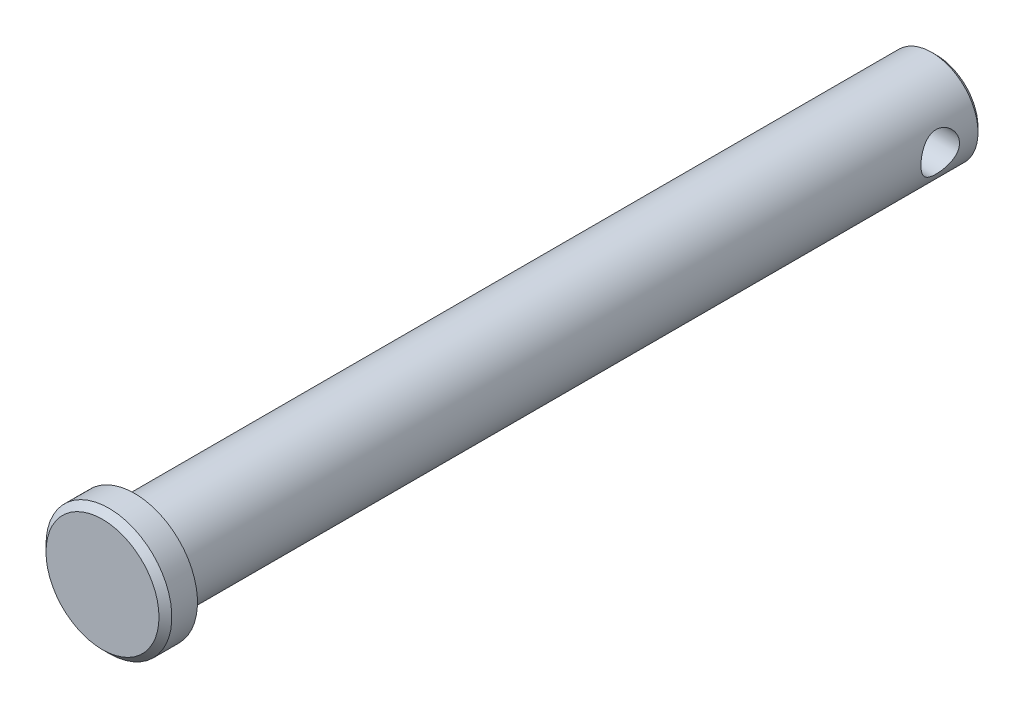
ISO-10303-21;
HEADER;
FILE_DESCRIPTION(('STEP AP214'),'2;1');
FILE_NAME('part.step','',(''),(''),'','','');
FILE_SCHEMA(('AUTOMOTIVE_DESIGN { 1 0 10303 214 1 1 1 1 }'));
ENDSEC;
DATA;
#1=APPLICATION_CONTEXT('core data for automotive mechanical design processes');
#2=APPLICATION_PROTOCOL_DEFINITION('international standard','automotive_design',2000,#1);
#3=PRODUCT_CONTEXT('',#1,'mechanical');
#4=PRODUCT('Part','Part','',(#3));
#5=PRODUCT_RELATED_PRODUCT_CATEGORY('part','',(#4));
#6=PRODUCT_DEFINITION_FORMATION('','',#4);
#7=PRODUCT_DEFINITION_CONTEXT('part definition',#1,'design');
#8=PRODUCT_DEFINITION('design','',#6,#7);
#9=PRODUCT_DEFINITION_SHAPE('','',#8);
#10=(LENGTH_UNIT() NAMED_UNIT(*) SI_UNIT(.MILLI.,.METRE.));
#11=(NAMED_UNIT(*) PLANE_ANGLE_UNIT() SI_UNIT($,.RADIAN.));
#12=(NAMED_UNIT(*) SI_UNIT($,.STERADIAN.) SOLID_ANGLE_UNIT());
#13=UNCERTAINTY_MEASURE_WITH_UNIT(LENGTH_MEASURE(1.E-05),#10,'distance_accuracy_value','');
#14=(GEOMETRIC_REPRESENTATION_CONTEXT(3) GLOBAL_UNCERTAINTY_ASSIGNED_CONTEXT((#13)) GLOBAL_UNIT_ASSIGNED_CONTEXT((#10,
#11,#12)) REPRESENTATION_CONTEXT('',''));
#15=CARTESIAN_POINT('',(0.,0.,0.));
#16=DIRECTION('',(0.,0.,1.));
#17=DIRECTION('',(1.,0.,0.));
#18=AXIS2_PLACEMENT_3D('',#15,#16,#17);
#19=CARTESIAN_POINT('',(0.,0.,41.275));
#20=DIRECTION('',(0.,0.,-1.));
#21=DIRECTION('',(-1.,0.,0.));
#22=AXIS2_PLACEMENT_3D('',#19,#20,#21);
#23=CYLINDRICAL_SURFACE('',#22,4.7625);
#24=CARTESIAN_POINT('',(0.,0.,-40.79875));
#25=DIRECTION('',(0.,0.,1.));
#26=DIRECTION('',(1.,0.,0.));
#27=AXIS2_PLACEMENT_3D('',#24,#25,#26);
#28=CIRCLE('',#27,4.7625);
#29=CARTESIAN_POINT('',(4.7625,0.,-40.79875));
#30=VERTEX_POINT('',#29);
#31=EDGE_CURVE('E40',#30,#30,#28,.T.);
#32=ORIENTED_EDGE('',*,*,#31,.T.);
#33=EDGE_LOOP('',(#32));
#34=FACE_BOUND('',#33,.T.);
#35=CARTESIAN_POINT('',(-4.7625,0.,-34.925));
#36=CARTESIAN_POINT('',(-4.76249140158045,-0.106295908560073,-34.9250114380824));
#37=CARTESIAN_POINT('',(-4.75890007347352,-0.212758967838845,-34.9335914841634));
#38=CARTESIAN_POINT('',(-4.74488118807538,-0.422667701710699,-34.9676070155608));
#39=CARTESIAN_POINT('',(-4.73443579242881,-0.526104765072408,-34.993086485087));
#40=CARTESIAN_POINT('',(-4.70783108848027,-0.726580864674278,-35.0597963582017));
#41=CARTESIAN_POINT('',(-4.69169114960318,-0.823640282526702,-35.1009734057807));
#42=CARTESIAN_POINT('',(-4.65526892272179,-1.00937973872919,-35.1976893568817));
#43=CARTESIAN_POINT('',(-4.63498788984898,-1.0980623041503,-35.2532239101163));
#44=CARTESIAN_POINT('',(-4.59117427508592,-1.26912434065072,-35.380023509863));
#45=CARTESIAN_POINT('',(-4.56753520905172,-1.35102801218446,-35.4518933277037));
#46=CARTESIAN_POINT('',(-4.52013183583765,-1.50202871598238,-35.6080446314673));
#47=CARTESIAN_POINT('',(-4.4963674694456,-1.57111900525552,-35.69233261077));
#48=CARTESIAN_POINT('',(-4.4500962212813,-1.69789058594091,-35.8759550093843));
#49=CARTESIAN_POINT('',(-4.42770874161498,-1.75484326694355,-35.9758256993771));
#50=CARTESIAN_POINT('',(-4.38841471116746,-1.85092880684824,-36.1847975469495));
#51=CARTESIAN_POINT('',(-4.37150533813807,-1.89007084577611,-36.2938939149316));
#52=CARTESIAN_POINT('',(-4.34623456677982,-1.94745924820552,-36.5127439856816));
#53=CARTESIAN_POINT('',(-4.33750065397212,-1.96662131880699,-36.6222128923851));
#54=CARTESIAN_POINT('',(-4.32849855373462,-1.98636270823876,-36.8431338521399));
#55=CARTESIAN_POINT('',(-4.328225697501,-1.98695227536355,-36.9545847775409));
#56=CARTESIAN_POINT('',(-4.33586127302854,-1.97022164952332,-37.1671850959405));
#57=CARTESIAN_POINT('',(-4.34314413823751,-1.95427093765777,-37.2684692407961));
#58=CARTESIAN_POINT('',(-4.36401341403402,-1.90720965737545,-37.4667654444631));
#59=CARTESIAN_POINT('',(-4.37760103179408,-1.87609618568393,-37.5637766812432));
#60=CARTESIAN_POINT('',(-4.40985568326751,-1.79898609480018,-37.7532228534989));
#61=CARTESIAN_POINT('',(-4.42862465094254,-1.75268686068537,-37.8455164807));
#62=CARTESIAN_POINT('',(-4.46910350686474,-1.64673347596642,-38.0213834025347));
#63=CARTESIAN_POINT('',(-4.49081455356025,-1.58707405869977,-38.104953239099));
#64=CARTESIAN_POINT('',(-4.53696350793792,-1.45017484530084,-38.2684336844884));
#65=CARTESIAN_POINT('',(-4.561476802296,-1.37187540459195,-38.3474381757244));
#66=CARTESIAN_POINT('',(-4.6089200606614,-1.20289572579428,-38.4914989359477));
#67=CARTESIAN_POINT('',(-4.63184965292253,-1.11221259562443,-38.5565519375613));
#68=CARTESIAN_POINT('',(-4.67420775145901,-0.918286118550733,-38.6721918699908));
#69=CARTESIAN_POINT('',(-4.69354323137542,-0.814801174635689,-38.7224102441767));
#70=CARTESIAN_POINT('',(-4.72582051746,-0.59984068901134,-38.8044073091202));
#71=CARTESIAN_POINT('',(-4.73876585655208,-0.488369601737113,-38.8361961907108));
#72=CARTESIAN_POINT('',(-4.75614430383386,-0.268173379937133,-38.878535387501));
#73=CARTESIAN_POINT('',(-4.76106396412311,-0.159720415379836,-38.890301723692));
#74=CARTESIAN_POINT('',(-4.76338979960382,0.0577130156000446,-38.8958871299874));
#75=CARTESIAN_POINT('',(-4.76079813192703,0.166693321604812,-38.8897113527751));
#76=CARTESIAN_POINT('',(-4.74870808030392,0.37639345971703,-38.8604584028704));
#77=CARTESIAN_POINT('',(-4.73955883563333,0.477254834540027,-38.8382351978707));
#78=CARTESIAN_POINT('',(-4.71564663251208,0.673707613991607,-38.7787067411665));
#79=CARTESIAN_POINT('',(-4.70088296486029,0.769298351097898,-38.7413995840539));
#80=CARTESIAN_POINT('',(-4.666587546492,0.955848037292255,-38.651543576057));
#81=CARTESIAN_POINT('',(-4.64692192707484,1.04657086350783,-38.5985572592557));
#82=CARTESIAN_POINT('',(-4.60492164769306,1.21816211826739,-38.4793277627557));
#83=CARTESIAN_POINT('',(-4.58258587495364,1.29902640975558,-38.4130790481973));
#84=CARTESIAN_POINT('',(-4.53567939534007,1.45467932056039,-38.2636661171801));
#85=CARTESIAN_POINT('',(-4.51106304400759,1.52862073304299,-38.1796313765093));
#86=CARTESIAN_POINT('',(-4.46380134619208,1.66158838069249,-37.9999537244526));
#87=CARTESIAN_POINT('',(-4.44115644808334,1.72061122865917,-37.9043081841649));
#88=CARTESIAN_POINT('',(-4.40025450662331,1.8227033683131,-37.7021499967072));
#89=CARTESIAN_POINT('',(-4.3820645555624,1.86553345201759,-37.5955019686202));
#90=CARTESIAN_POINT('',(-4.35305764608595,1.93226394648122,-37.3755116823265));
#91=CARTESIAN_POINT('',(-4.34223460919756,1.95617996596104,-37.2621750270577));
#92=CARTESIAN_POINT('',(-4.33011523702907,1.98285227553879,-37.0414253150213));
#93=CARTESIAN_POINT('',(-4.32814969660371,1.98709566405842,-36.9342278486105));
#94=CARTESIAN_POINT('',(-4.33218991655001,1.9782722614421,-36.7207119579385));
#95=CARTESIAN_POINT('',(-4.33819445320237,1.96520812768995,-36.614393401252));
#96=CARTESIAN_POINT('',(-4.3568866269235,1.92338967589029,-36.4107527633931));
#97=CARTESIAN_POINT('',(-4.36925013318788,1.89539409419702,-36.3132422808769));
#98=CARTESIAN_POINT('',(-4.39901300153713,1.82524921020888,-36.1242800160954));
#99=CARTESIAN_POINT('',(-4.41641377846563,1.78309593083637,-36.0328299449294));
#100=CARTESIAN_POINT('',(-4.45558790364021,1.68291328922589,-35.8525827651808));
#101=CARTESIAN_POINT('',(-4.47756125557966,1.62408172945392,-35.7642758008579));
#102=CARTESIAN_POINT('',(-4.5228460637297,1.49333596530074,-35.5983220287649));
#103=CARTESIAN_POINT('',(-4.54615798199076,1.42141722463767,-35.5206789337341));
#104=CARTESIAN_POINT('',(-4.59353273649544,1.26031949767388,-35.3724389678255));
#105=CARTESIAN_POINT('',(-4.61752660299969,1.17026489966908,-35.3027671628655));
#106=CARTESIAN_POINT('',(-4.66185477999957,0.978852625814453,-35.1794771174995));
#107=CARTESIAN_POINT('',(-4.68218742117825,0.877489827988869,-35.1258661926128));
#108=CARTESIAN_POINT('',(-4.71660828587906,0.667912140039742,-35.0373793703642));
#109=CARTESIAN_POINT('',(-4.73079417348867,0.559838210681756,-35.002208432995));
#110=CARTESIAN_POINT('',(-4.75172103007692,0.33878904468141,-34.9508662025889));
#111=CARTESIAN_POINT('',(-4.75848530476497,0.225830315707268,-34.9346354224838));
#112=CARTESIAN_POINT('',(-4.76206006515682,0.074987280046702,-34.9260586067753));
#113=CARTESIAN_POINT('',(-4.76250303375275,0.0375040440476048,-34.9249959643381));
#114=CARTESIAN_POINT('',(-4.7625,0.,-34.925));
#115=B_SPLINE_CURVE_WITH_KNOTS('',3,(#35,#36,#37,#38,#39,#40,#41,#42,#43,#44,#45,#46,#47,#48,
#49,#50,#51,#52,#53,#54,#55,#56,#57,#58,#59,#60,#61,#62,#63,#64,#65,#66,#67,#68,#69,#70,#71,#72,
#73,#74,#75,#76,#77,#78,#79,#80,#81,#82,#83,#84,#85,#86,#87,#88,#89,#90,#91,#92,#93,#94,#95,#96,
#97,#98,#99,#100,#101,#102,#103,#104,#105,#106,#107,#108,#109,#110,#111,#112,#113,#114),
.UNSPECIFIED.,.T.,.F.,(4,2,2,2,2,2,2,2,2,2,2,2,2,2,2,2,2,2,2,2,2,2,2,2,2,2,2,2,2,2,2,2,2,2,2,2,
2,2,2,4),(0.,0.318780983728251,0.638394933248055,0.956932064901255,1.2753727935041,
1.60842223858481,1.94164645533701,2.2912661270586,2.64070539184808,2.97331246105872,
3.30573599470361,3.61267624559059,3.9196752906695,4.23320706980709,4.54686266326065,
4.88702574040534,5.22726839536908,5.57536437409041,5.92326768446546,6.24916903886785,
6.57497680895409,6.88461586205457,7.19429404105333,7.51359202244555,7.83302353682824,
8.17528349746504,8.51762109719041,8.86483476520742,9.21176159730895,9.53198305625933,
9.85215535434837,10.1574226931906,10.462775857341,10.7864893076844,11.1103151781368,
11.4577262432026,11.8052953096787,12.1471190861327,12.4878663512005,12.6003408219232),.UNSPECIFIED.);
#116=CARTESIAN_POINT('',(-4.7625,0.,-34.925));
#117=VERTEX_POINT('',#116);
#118=EDGE_CURVE('E51',#117,#117,#115,.T.);
#119=ORIENTED_EDGE('',*,*,#118,.T.);
#120=EDGE_LOOP('',(#119));
#121=FACE_BOUND('',#120,.T.);
#122=CARTESIAN_POINT('',(4.7625,0.,-38.89375));
#123=CARTESIAN_POINT('',(4.76249140158045,-0.106295908560074,-38.8937385619176));
#124=CARTESIAN_POINT('',(4.75890007347352,-0.212758967838847,-38.8851585158366));
#125=CARTESIAN_POINT('',(4.74488118807538,-0.4226677017107,-38.8511429844392));
#126=CARTESIAN_POINT('',(4.73443579242881,-0.526104765072408,-38.825663514913));
#127=CARTESIAN_POINT('',(4.70783108848027,-0.726580864674276,-38.7589536417983));
#128=CARTESIAN_POINT('',(4.69169114960318,-0.8236402825267,-38.7177765942193));
#129=CARTESIAN_POINT('',(4.65526892272179,-1.00937973872918,-38.6210606431183));
#130=CARTESIAN_POINT('',(4.63498788984898,-1.0980623041503,-38.5655260898838));
#131=CARTESIAN_POINT('',(4.59117427508592,-1.26912434065072,-38.438726490137));
#132=CARTESIAN_POINT('',(4.56753520905172,-1.35102801218446,-38.3668566722963));
#133=CARTESIAN_POINT('',(4.52013183583765,-1.50202871598238,-38.2107053685327));
#134=CARTESIAN_POINT('',(4.4963674694456,-1.57111900525552,-38.12641738923));
#135=CARTESIAN_POINT('',(4.4500962212813,-1.69789058594091,-37.9427949906157));
#136=CARTESIAN_POINT('',(4.42770874161498,-1.75484326694355,-37.8429243006229));
#137=CARTESIAN_POINT('',(4.38841471116746,-1.85092880684824,-37.6339524530505));
#138=CARTESIAN_POINT('',(4.37150533813807,-1.89007084577611,-37.5248560850684));
#139=CARTESIAN_POINT('',(4.34623456677982,-1.94745924820552,-37.3060060143184));
#140=CARTESIAN_POINT('',(4.33750065397212,-1.96662131880698,-37.196537107615));
#141=CARTESIAN_POINT('',(4.32849855373462,-1.98636270823876,-36.9756161478601));
#142=CARTESIAN_POINT('',(4.328225697501,-1.98695227536355,-36.8641652224591));
#143=CARTESIAN_POINT('',(4.33586127302854,-1.97022164952332,-36.6515649040595));
#144=CARTESIAN_POINT('',(4.34314413823751,-1.95427093765777,-36.5502807592039));
#145=CARTESIAN_POINT('',(4.36401341403402,-1.90720965737545,-36.3519845555369));
#146=CARTESIAN_POINT('',(4.37760103179407,-1.87609618568393,-36.2549733187568));
#147=CARTESIAN_POINT('',(4.40985568326751,-1.79898609480018,-36.0655271465011));
#148=CARTESIAN_POINT('',(4.42862465094254,-1.75268686068537,-35.9732335193));
#149=CARTESIAN_POINT('',(4.46910350686474,-1.64673347596642,-35.7973665974653));
#150=CARTESIAN_POINT('',(4.49081455356025,-1.58707405869977,-35.713796760901));
#151=CARTESIAN_POINT('',(4.53696350793792,-1.45017484530084,-35.5503163155116));
#152=CARTESIAN_POINT('',(4.561476802296,-1.37187540459195,-35.4713118242756));
#153=CARTESIAN_POINT('',(4.6089200606614,-1.20289572579428,-35.3272510640523));
#154=CARTESIAN_POINT('',(4.63184965292253,-1.11221259562443,-35.2621980624387));
#155=CARTESIAN_POINT('',(4.67420775145901,-0.918286118550734,-35.1465581300092));
#156=CARTESIAN_POINT('',(4.69354323137542,-0.814801174635689,-35.0963397558233));
#157=CARTESIAN_POINT('',(4.72582051746,-0.599840689011341,-35.0143426908798));
#158=CARTESIAN_POINT('',(4.73876585655208,-0.488369601737113,-34.9825538092892));
#159=CARTESIAN_POINT('',(4.75614430383386,-0.268173379937133,-34.940214612499));
#160=CARTESIAN_POINT('',(4.76106396412311,-0.159720415379836,-34.9284482763081));
#161=CARTESIAN_POINT('',(4.76338979960382,0.0577130156000439,-34.9228628700126));
#162=CARTESIAN_POINT('',(4.76079813192703,0.166693321604811,-34.929038647225));
#163=CARTESIAN_POINT('',(4.74870808030392,0.376393459717029,-34.9582915971296));
#164=CARTESIAN_POINT('',(4.73955883563333,0.477254834540026,-34.9805148021293));
#165=CARTESIAN_POINT('',(4.71564663251208,0.673707613991606,-35.0400432588335));
#166=CARTESIAN_POINT('',(4.7008829648603,0.769298351097898,-35.0773504159461));
#167=CARTESIAN_POINT('',(4.666587546492,0.955848037292255,-35.167206423943));
#168=CARTESIAN_POINT('',(4.64692192707484,1.04657086350783,-35.2201927407443));
#169=CARTESIAN_POINT('',(4.60492164769306,1.21816211826739,-35.3394222372443));
#170=CARTESIAN_POINT('',(4.58258587495364,1.29902640975558,-35.4056709518027));
#171=CARTESIAN_POINT('',(4.53567939534007,1.45467932056039,-35.55508388282));
#172=CARTESIAN_POINT('',(4.51106304400759,1.52862073304299,-35.6391186234907));
#173=CARTESIAN_POINT('',(4.46380134619208,1.66158838069249,-35.8187962755475));
#174=CARTESIAN_POINT('',(4.44115644808334,1.72061122865917,-35.9144418158351));
#175=CARTESIAN_POINT('',(4.40025450662331,1.8227033683131,-36.1166000032929));
#176=CARTESIAN_POINT('',(4.3820645555624,1.86553345201759,-36.2232480313798));
#177=CARTESIAN_POINT('',(4.35305764608595,1.93226394648122,-36.4432383176735));
#178=CARTESIAN_POINT('',(4.34223460919756,1.95617996596104,-36.5565749729423));
#179=CARTESIAN_POINT('',(4.33011523702907,1.98285227553879,-36.7773246849788));
#180=CARTESIAN_POINT('',(4.32814969660371,1.98709566405842,-36.8845221513895));
#181=CARTESIAN_POINT('',(4.33218991655001,1.9782722614421,-37.0980380420615));
#182=CARTESIAN_POINT('',(4.33819445320237,1.96520812768995,-37.204356598748));
#183=CARTESIAN_POINT('',(4.3568866269235,1.92338967589029,-37.4079972366069));
#184=CARTESIAN_POINT('',(4.36925013318788,1.89539409419702,-37.5055077191231));
#185=CARTESIAN_POINT('',(4.39901300153713,1.82524921020888,-37.6944699839046));
#186=CARTESIAN_POINT('',(4.41641377846563,1.78309593083637,-37.7859200550706));
#187=CARTESIAN_POINT('',(4.45558790364021,1.68291328922589,-37.9661672348192));
#188=CARTESIAN_POINT('',(4.47756125557966,1.62408172945392,-38.0544741991422));
#189=CARTESIAN_POINT('',(4.5228460637297,1.49333596530074,-38.2204279712351));
#190=CARTESIAN_POINT('',(4.54615798199076,1.42141722463767,-38.2980710662659));
#191=CARTESIAN_POINT('',(4.59353273649544,1.26031949767387,-38.4463110321745));
#192=CARTESIAN_POINT('',(4.61752660299969,1.17026489966908,-38.5159828371345));
#193=CARTESIAN_POINT('',(4.66185477999957,0.978852625814449,-38.6392728825005));
#194=CARTESIAN_POINT('',(4.68218742117825,0.877489827988869,-38.6928838073872));
#195=CARTESIAN_POINT('',(4.71660828587906,0.667912140039744,-38.7813706296358));
#196=CARTESIAN_POINT('',(4.73079417348868,0.559838210681756,-38.816541567005));
#197=CARTESIAN_POINT('',(4.75172103007692,0.338789044681409,-38.8678837974111));
#198=CARTESIAN_POINT('',(4.75848530476497,0.225830315707268,-38.8841145775162));
#199=CARTESIAN_POINT('',(4.76206006515682,0.0749872800467027,-38.8926913932247));
#200=CARTESIAN_POINT('',(4.76250303375275,0.0375040440476052,-38.8937540356619));
#201=CARTESIAN_POINT('',(4.7625,0.,-38.89375));
#202=B_SPLINE_CURVE_WITH_KNOTS('',3,(#122,#123,#124,#125,#126,#127,#128,#129,#130,#131,#132,
#133,#134,#135,#136,#137,#138,#139,#140,#141,#142,#143,#144,#145,#146,#147,#148,#149,#150,#151,
#152,#153,#154,#155,#156,#157,#158,#159,#160,#161,#162,#163,#164,#165,#166,#167,#168,#169,#170,
#171,#172,#173,#174,#175,#176,#177,#178,#179,#180,#181,#182,#183,#184,#185,#186,#187,#188,#189,
#190,#191,#192,#193,#194,#195,#196,#197,#198,#199,#200,#201),.UNSPECIFIED.,.T.,.F.,(4,2,2,2,2,2,
2,2,2,2,2,2,2,2,2,2,2,2,2,2,2,2,2,2,2,2,2,2,2,2,2,2,2,2,2,2,2,2,2,4),(0.,0.318780983728252,
0.638394933248055,0.956932064901252,1.2753727935041,1.60842223858481,1.94164645533701,
2.2912661270586,2.64070539184808,2.97331246105871,3.3057359947036,3.61267624559058,
3.9196752906695,4.23320706980709,4.54686266326065,4.88702574040534,5.22726839536908,
5.57536437409041,5.92326768446546,6.24916903886785,6.57497680895409,6.88461586205457,
7.19429404105333,7.51359202244555,7.83302353682824,8.17528349746504,8.51762109719041,
8.86483476520742,9.21176159730895,9.53198305625933,9.85215535434837,10.1574226931906,
10.462775857341,10.7864893076844,11.1103151781368,11.4577262432026,11.8052953096787,
12.1471190861327,12.4878663512005,12.6003408219232),.UNSPECIFIED.);
#203=CARTESIAN_POINT('',(4.7625,0.,-38.89375));
#204=VERTEX_POINT('',#203);
#205=EDGE_CURVE('E59',#204,#204,#202,.T.);
#206=ORIENTED_EDGE('',*,*,#205,.T.);
#207=EDGE_LOOP('',(#206));
#208=FACE_BOUND('',#207,.T.);
#209=CARTESIAN_POINT('',(0.,0.,41.275));
#210=DIRECTION('',(0.,0.,1.));
#211=DIRECTION('',(1.,0.,0.));
#212=AXIS2_PLACEMENT_3D('',#209,#210,#211);
#213=CIRCLE('',#212,4.7625);
#214=CARTESIAN_POINT('',(4.7625,0.,41.275));
#215=VERTEX_POINT('',#214);
#216=EDGE_CURVE('E97',#215,#215,#213,.T.);
#217=ORIENTED_EDGE('',*,*,#216,.F.);
#218=EDGE_LOOP('',(#217));
#219=FACE_BOUND('',#218,.T.);
#220=ADVANCED_FACE('F33',(#34,#121,#208,#219),#23,.T.);
#221=CARTESIAN_POINT('',(0.,0.,-41.275));
#222=DIRECTION('',(0.,0.,1.));
#223=DIRECTION('',(1.,0.,0.));
#224=AXIS2_PLACEMENT_3D('',#221,#222,#223);
#225=PLANE('',#224);
#226=CARTESIAN_POINT('',(0.,0.,-41.275));
#227=DIRECTION('',(0.,0.,1.));
#228=DIRECTION('',(1.,0.,0.));
#229=AXIS2_PLACEMENT_3D('',#226,#227,#228);
#230=CIRCLE('',#229,4.28625000000001);
#231=CARTESIAN_POINT('',(4.28625000000001,0.,-41.275));
#232=VERTEX_POINT('',#231);
#233=EDGE_CURVE('E10',#232,#232,#230,.F.);
#234=ORIENTED_EDGE('',*,*,#233,.T.);
#235=EDGE_LOOP('',(#234));
#236=FACE_BOUND('',#235,.T.);
#237=ADVANCED_FACE('F79',(#236),#225,.F.);
#238=CARTESIAN_POINT('',(0.,0.,41.275));
#239=DIRECTION('',(0.,0.,1.));
#240=DIRECTION('',(1.,0.,0.));
#241=AXIS2_PLACEMENT_3D('',#238,#239,#240);
#242=PLANE('',#241);
#243=CARTESIAN_POINT('',(0.,0.,41.275));
#244=DIRECTION('',(0.,0.,1.));
#245=DIRECTION('',(1.,0.,0.));
#246=AXIS2_PLACEMENT_3D('',#243,#244,#245);
#247=CIRCLE('',#246,6.477);
#248=CARTESIAN_POINT('',(-6.477,0.,41.275));
#249=VERTEX_POINT('',#248);
#250=EDGE_CURVE('E58',#249,#249,#247,.T.);
#251=ORIENTED_EDGE('',*,*,#250,.F.);
#252=EDGE_LOOP('',(#251));
#253=FACE_BOUND('',#252,.T.);
#254=ORIENTED_EDGE('',*,*,#216,.T.);
#255=EDGE_LOOP('',(#254));
#256=FACE_BOUND('',#255,.T.);
#257=ADVANCED_FACE('F76',(#253,#256),#242,.F.);
#258=CARTESIAN_POINT('',(0.,0.,44.577));
#259=DIRECTION('',(0.,0.,-1.));
#260=DIRECTION('',(-1.,0.,0.));
#261=AXIS2_PLACEMENT_3D('',#258,#259,#260);
#262=CYLINDRICAL_SURFACE('',#261,6.477);
#263=CARTESIAN_POINT('',(0.,0.,43.9166000000001));
#264=DIRECTION('',(0.,0.,1.));
#265=DIRECTION('',(1.,0.,0.));
#266=AXIS2_PLACEMENT_3D('',#263,#264,#265);
#267=CIRCLE('',#266,6.477);
#268=CARTESIAN_POINT('',(-6.477,0.,43.9166000000001));
#269=VERTEX_POINT('',#268);
#270=EDGE_CURVE('E44',#269,#269,#267,.F.);
#271=CARTESIAN_POINT('',(-6.477,0.,43.9166000000001));
#272=CARTESIAN_POINT('',(-6.477,0.,43.8890833333334));
#273=CARTESIAN_POINT('',(-6.477,0.,43.8615666666667));
#274=CARTESIAN_POINT('',(-6.477,0.,43.8065333333334));
#275=CARTESIAN_POINT('',(-6.477,0.,43.7790166666667));
#276=CARTESIAN_POINT('',(-6.477,0.,43.7239833333334));
#277=CARTESIAN_POINT('',(-6.477,0.,43.6964666666667));
#278=CARTESIAN_POINT('',(-6.477,0.,43.6414333333334));
#279=CARTESIAN_POINT('',(-6.477,0.,43.6139166666667));
#280=CARTESIAN_POINT('',(-6.477,0.,43.5588833333334));
#281=CARTESIAN_POINT('',(-6.477,0.,43.5313666666667));
#282=CARTESIAN_POINT('',(-6.477,0.,43.4763333333334));
#283=CARTESIAN_POINT('',(-6.477,0.,43.4488166666667));
#284=CARTESIAN_POINT('',(-6.477,0.,43.3937833333334));
#285=CARTESIAN_POINT('',(-6.477,0.,43.3662666666667));
#286=CARTESIAN_POINT('',(-6.477,0.,43.3112333333334));
#287=CARTESIAN_POINT('',(-6.477,0.,43.2837166666667));
#288=CARTESIAN_POINT('',(-6.477,0.,43.2286833333334));
#289=CARTESIAN_POINT('',(-6.477,0.,43.2011666666667));
#290=CARTESIAN_POINT('',(-6.477,0.,43.1461333333334));
#291=CARTESIAN_POINT('',(-6.477,0.,43.1186166666667));
#292=CARTESIAN_POINT('',(-6.477,0.,43.0635833333334));
#293=CARTESIAN_POINT('',(-6.477,0.,43.0360666666667));
#294=CARTESIAN_POINT('',(-6.477,0.,42.9810333333334));
#295=CARTESIAN_POINT('',(-6.477,0.,42.9535166666667));
#296=CARTESIAN_POINT('',(-6.477,0.,42.8984833333334));
#297=CARTESIAN_POINT('',(-6.477,0.,42.8709666666667));
#298=CARTESIAN_POINT('',(-6.477,0.,42.8159333333334));
#299=CARTESIAN_POINT('',(-6.477,0.,42.7884166666667));
#300=CARTESIAN_POINT('',(-6.477,0.,42.7333833333334));
#301=CARTESIAN_POINT('',(-6.477,0.,42.7058666666667));
#302=CARTESIAN_POINT('',(-6.477,0.,42.6508333333334));
#303=CARTESIAN_POINT('',(-6.477,0.,42.6233166666667));
#304=CARTESIAN_POINT('',(-6.477,0.,42.5682833333334));
#305=CARTESIAN_POINT('',(-6.477,0.,42.5407666666667));
#306=CARTESIAN_POINT('',(-6.477,0.,42.4857333333334));
#307=CARTESIAN_POINT('',(-6.477,0.,42.4582166666667));
#308=CARTESIAN_POINT('',(-6.477,0.,42.4031833333334));
#309=CARTESIAN_POINT('',(-6.477,0.,42.3756666666667));
#310=CARTESIAN_POINT('',(-6.477,0.,42.3206333333334));
#311=CARTESIAN_POINT('',(-6.477,0.,42.2931166666667));
#312=CARTESIAN_POINT('',(-6.477,0.,42.2380833333334));
#313=CARTESIAN_POINT('',(-6.477,0.,42.2105666666667));
#314=CARTESIAN_POINT('',(-6.477,0.,42.1555333333334));
#315=CARTESIAN_POINT('',(-6.477,0.,42.1280166666667));
#316=CARTESIAN_POINT('',(-6.477,0.,42.0729833333333));
#317=CARTESIAN_POINT('',(-6.477,0.,42.0454666666667));
#318=CARTESIAN_POINT('',(-6.477,0.,41.9904333333333));
#319=CARTESIAN_POINT('',(-6.477,0.,41.9629166666667));
#320=CARTESIAN_POINT('',(-6.477,0.,41.9078833333333));
#321=CARTESIAN_POINT('',(-6.477,0.,41.8803666666667));
#322=CARTESIAN_POINT('',(-6.477,0.,41.8253333333333));
#323=CARTESIAN_POINT('',(-6.477,0.,41.7978166666667));
#324=CARTESIAN_POINT('',(-6.477,0.,41.7427833333333));
#325=CARTESIAN_POINT('',(-6.477,0.,41.7152666666667));
#326=CARTESIAN_POINT('',(-6.477,0.,41.6602333333333));
#327=CARTESIAN_POINT('',(-6.477,0.,41.6327166666667));
#328=CARTESIAN_POINT('',(-6.477,0.,41.5776833333333));
#329=CARTESIAN_POINT('',(-6.477,0.,41.5501666666667));
#330=CARTESIAN_POINT('',(-6.477,0.,41.4951333333333));
#331=CARTESIAN_POINT('',(-6.477,0.,41.4676166666667));
#332=CARTESIAN_POINT('',(-6.477,0.,41.4125833333333));
#333=CARTESIAN_POINT('',(-6.477,0.,41.3850666666667));
#334=CARTESIAN_POINT('',(-6.477,0.,41.3300333333333));
#335=CARTESIAN_POINT('',(-6.477,0.,41.3025166666667));
#336=CARTESIAN_POINT('',(-6.477,0.,41.275));
#337=B_SPLINE_CURVE_WITH_KNOTS('',3,(#271,#272,#273,#274,#275,#276,#277,#278,#279,#280,#281,
#282,#283,#284,#285,#286,#287,#288,#289,#290,#291,#292,#293,#294,#295,#296,#297,#298,#299,#300,
#301,#302,#303,#304,#305,#306,#307,#308,#309,#310,#311,#312,#313,#314,#315,#316,#317,#318,#319,
#320,#321,#322,#323,#324,#325,#326,#327,#328,#329,#330,#331,#332,#333,#334,#335,#336),
.UNSPECIFIED.,.F.,.F.,(4,2,2,2,2,2,2,2,2,2,2,2,2,2,2,2,2,2,2,2,2,2,2,2,2,2,2,2,2,2,2,2,4),(0.,
0.0825500000000007,0.165100000000001,0.247650000000002,0.330200000000003,0.41275000000001,
0.495300000000011,0.577850000000012,0.660400000000012,0.742950000000013,0.825500000000021,
0.908050000000021,0.990600000000022,1.07315000000002,1.15570000000003,1.23825000000003,
1.32080000000003,1.40335000000003,1.48590000000003,1.56845000000004,1.65100000000004,
1.73355000000004,1.81610000000004,1.89865000000005,1.98120000000005,2.06375000000005,
2.14630000000005,2.22885000000005,2.31140000000006,2.39395000000006,2.47650000000006,
2.55905000000006,2.64160000000006),.UNSPECIFIED.);
#338=EDGE_CURVE('BSEAM74',#269,#249,#337,.T.);
#339=ORIENTED_EDGE('',*,*,#270,.T.);
#340=ORIENTED_EDGE('',*,*,#250,.T.);
#341=ORIENTED_EDGE('',*,*,#338,.T.);
#342=ORIENTED_EDGE('',*,*,#338,.F.);
#343=EDGE_LOOP('',(#339,#341,#340,#342));
#344=FACE_BOUND('',#343,.T.);
#345=ADVANCED_FACE('F74',(#344),#262,.T.);
#346=CARTESIAN_POINT('',(0.,0.,44.577));
#347=DIRECTION('',(0.,0.,1.));
#348=DIRECTION('',(1.,0.,0.));
#349=AXIS2_PLACEMENT_3D('',#346,#347,#348);
#350=PLANE('',#349);
#351=CARTESIAN_POINT('',(0.,0.,44.577));
#352=DIRECTION('',(0.,0.,1.));
#353=DIRECTION('',(1.,0.,0.));
#354=AXIS2_PLACEMENT_3D('',#351,#352,#353);
#355=CIRCLE('',#354,5.81660000000007);
#356=CARTESIAN_POINT('',(5.81660000000007,0.,44.577));
#357=VERTEX_POINT('',#356);
#358=EDGE_CURVE('E48',#357,#357,#355,.T.);
#359=ORIENTED_EDGE('',*,*,#358,.T.);
#360=EDGE_LOOP('',(#359));
#361=FACE_BOUND('',#360,.T.);
#362=ADVANCED_FACE('F70',(#361),#350,.T.);
#363=CARTESIAN_POINT('',(0.,0.,44.577));
#364=DIRECTION('',(0.,0.,-1.));
#365=DIRECTION('',(-1.,0.,0.));
#366=AXIS2_PLACEMENT_3D('',#363,#364,#365);
#367=CONICAL_SURFACE('',#366,5.81660000000007,0.785398163397446);
#368=ORIENTED_EDGE('',*,*,#270,.F.);
#369=EDGE_LOOP('',(#368));
#370=FACE_BOUND('',#369,.T.);
#371=ORIENTED_EDGE('',*,*,#358,.F.);
#372=EDGE_LOOP('',(#371));
#373=FACE_BOUND('',#372,.T.);
#374=ADVANCED_FACE('F68',(#370,#373),#367,.T.);
#375=CARTESIAN_POINT('',(-6.477,0.,-36.909375));
#376=DIRECTION('',(1.,0.,0.));
#377=DIRECTION('',(0.,0.,-1.));
#378=AXIS2_PLACEMENT_3D('',#375,#376,#377);
#379=CYLINDRICAL_SURFACE('',#378,1.984375);
#380=ORIENTED_EDGE('',*,*,#205,.F.);
#381=EDGE_LOOP('',(#380));
#382=FACE_BOUND('',#381,.T.);
#383=ORIENTED_EDGE('',*,*,#118,.F.);
#384=EDGE_LOOP('',(#383));
#385=FACE_BOUND('',#384,.T.);
#386=ADVANCED_FACE('F64',(#382,#385),#379,.F.);
#387=CARTESIAN_POINT('',(0.,0.,-40.79875));
#388=DIRECTION('',(0.,0.,1.));
#389=DIRECTION('',(1.,0.,0.));
#390=AXIS2_PLACEMENT_3D('',#387,#388,#389);
#391=CONICAL_SURFACE('',#390,4.7625,0.785398163397453);
#392=ORIENTED_EDGE('',*,*,#233,.F.);
#393=EDGE_LOOP('',(#392));
#394=FACE_BOUND('',#393,.T.);
#395=ORIENTED_EDGE('',*,*,#31,.F.);
#396=EDGE_LOOP('',(#395));
#397=FACE_BOUND('',#396,.T.);
#398=ADVANCED_FACE('F35',(#394,#397),#391,.T.);
#399=CLOSED_SHELL('',(#220,#237,#257,#345,#362,#374,#386,#398));
#400=MANIFOLD_SOLID_BREP('B2',#399);
#401=ADVANCED_BREP_SHAPE_REPRESENTATION('',(#18,#400),#14);
#402=SHAPE_DEFINITION_REPRESENTATION(#9,#401);
ENDSEC;
END-ISO-10303-21;
